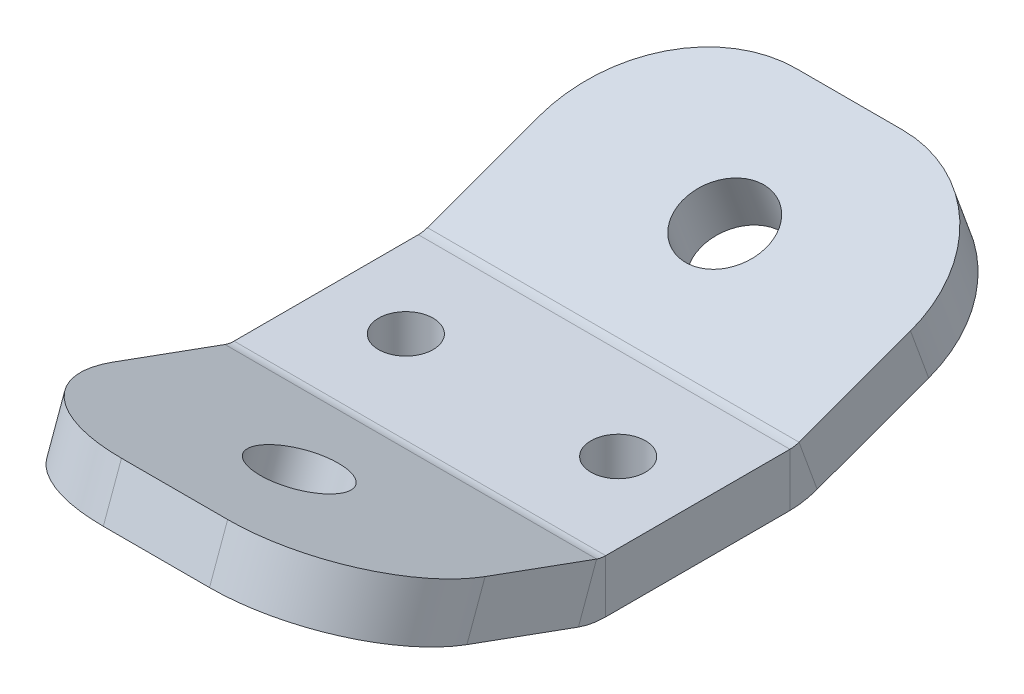
ISO-10303-21;
HEADER;
FILE_DESCRIPTION(('STEP AP214'),'2;1');
FILE_NAME('part.step','',(''),(''),'','','');
FILE_SCHEMA(('AUTOMOTIVE_DESIGN { 1 0 10303 214 1 1 1 1 }'));
ENDSEC;
DATA;
#1=APPLICATION_CONTEXT('core data for automotive mechanical design processes');
#2=APPLICATION_PROTOCOL_DEFINITION('international standard','automotive_design',2000,#1);
#3=PRODUCT_CONTEXT('',#1,'mechanical');
#4=PRODUCT('Part','Part','',(#3));
#5=PRODUCT_RELATED_PRODUCT_CATEGORY('part','',(#4));
#6=PRODUCT_DEFINITION_FORMATION('','',#4);
#7=PRODUCT_DEFINITION_CONTEXT('part definition',#1,'design');
#8=PRODUCT_DEFINITION('design','',#6,#7);
#9=PRODUCT_DEFINITION_SHAPE('','',#8);
#10=(LENGTH_UNIT() NAMED_UNIT(*) SI_UNIT(.MILLI.,.METRE.));
#11=(NAMED_UNIT(*) PLANE_ANGLE_UNIT() SI_UNIT($,.RADIAN.));
#12=(NAMED_UNIT(*) SI_UNIT($,.STERADIAN.) SOLID_ANGLE_UNIT());
#13=UNCERTAINTY_MEASURE_WITH_UNIT(LENGTH_MEASURE(1.E-05),#10,'distance_accuracy_value','');
#14=(GEOMETRIC_REPRESENTATION_CONTEXT(3) GLOBAL_UNCERTAINTY_ASSIGNED_CONTEXT((#13)) GLOBAL_UNIT_ASSIGNED_CONTEXT((#10,
#11,#12)) REPRESENTATION_CONTEXT('',''));
#15=CARTESIAN_POINT('',(0.,0.,0.));
#16=DIRECTION('',(0.,0.,1.));
#17=DIRECTION('',(1.,0.,0.));
#18=AXIS2_PLACEMENT_3D('',#15,#16,#17);
#19=CARTESIAN_POINT('',(22.225,0.,-11.0204855087519));
#20=DIRECTION('',(1.,0.,0.));
#21=DIRECTION('',(0.,0.,-1.));
#22=AXIS2_PLACEMENT_3D('',#19,#20,#21);
#23=PLANE('',#22);
#24=DIRECTION('',(0.,1.,0.));
#25=VECTOR('',#24,1.);
#26=CARTESIAN_POINT('',(22.225,0.,-11.0204855087519));
#27=LINE('',#26,#25);
#28=CARTESIAN_POINT('',(22.225,0.,-11.0204855087519));
#29=VERTEX_POINT('',#28);
#30=CARTESIAN_POINT('',(22.225,6.35,-11.0204855087519));
#31=VERTEX_POINT('',#30);
#32=EDGE_CURVE('E278',#29,#31,#27,.T.);
#33=ORIENTED_EDGE('',*,*,#32,.F.);
#34=CARTESIAN_POINT('',(22.225,9.525,-11.0204855087519));
#35=DIRECTION('',(1.,0.,0.));
#36=DIRECTION('',(0.,0.,-1.));
#37=AXIS2_PLACEMENT_3D('',#34,#35,#36);
#38=CIRCLE('',#37,9.525);
#39=CARTESIAN_POINT('',(22.225,0.574427787014234,-14.2782273739289));
#40=VERTEX_POINT('',#39);
#41=EDGE_CURVE('E196',#40,#29,#38,.F.);
#42=ORIENTED_EDGE('',*,*,#41,.F.);
#43=DIRECTION('',(0.,-0.939692620785908,-0.34202014332567));
#44=VECTOR('',#43,1.);
#45=CARTESIAN_POINT('',(22.225,6.54147592900475,-12.1063994638109));
#46=LINE('',#45,#44);
#47=CARTESIAN_POINT('',(22.225,6.54147592900475,-12.1063994638109));
#48=VERTEX_POINT('',#47);
#49=EDGE_CURVE('E275',#48,#40,#46,.T.);
#50=ORIENTED_EDGE('',*,*,#49,.F.);
#51=CARTESIAN_POINT('',(22.225,9.525,-11.0204855087519));
#52=DIRECTION('',(1.,0.,0.));
#53=DIRECTION('',(0.,0.,-1.));
#54=AXIS2_PLACEMENT_3D('',#51,#52,#53);
#55=CIRCLE('',#54,3.175);
#56=EDGE_CURVE('E206',#48,#31,#55,.F.);
#57=ORIENTED_EDGE('',*,*,#56,.T.);
#58=EDGE_LOOP('',(#33,#42,#50,#57));
#59=FACE_BOUND('',#58,.T.);
#60=ADVANCED_FACE('F38',(#59),#23,.T.);
#61=CARTESIAN_POINT('',(22.225,6.54147592900475,-12.1063994638109));
#62=DIRECTION('',(1.,0.,0.));
#63=DIRECTION('',(0.,0.,-1.));
#64=AXIS2_PLACEMENT_3D('',#61,#62,#63);
#65=PLANE('',#64);
#66=DIRECTION('',(0.,0.,1.));
#67=VECTOR('',#66,1.);
#68=CARTESIAN_POINT('',(22.225,0.,12.7));
#69=LINE('',#68,#67);
#70=CARTESIAN_POINT('',(22.225,0.,11.0204855087519));
#71=VERTEX_POINT('',#70);
#72=EDGE_CURVE('E194',#29,#71,#69,.T.);
#73=ORIENTED_EDGE('',*,*,#72,.F.);
#74=ORIENTED_EDGE('',*,*,#32,.T.);
#75=DIRECTION('',(0.,0.,-1.));
#76=VECTOR('',#75,1.);
#77=CARTESIAN_POINT('',(22.225,6.35,12.7));
#78=LINE('',#77,#76);
#79=CARTESIAN_POINT('',(22.225,6.35,11.0204855087519));
#80=VERTEX_POINT('',#79);
#81=EDGE_CURVE('E209',#31,#80,#78,.F.);
#82=ORIENTED_EDGE('',*,*,#81,.T.);
#83=DIRECTION('',(0.,-1.,0.));
#84=VECTOR('',#83,1.);
#85=CARTESIAN_POINT('',(22.225,6.35,11.0204855087519));
#86=LINE('',#85,#84);
#87=EDGE_CURVE('E167',#80,#71,#86,.T.);
#88=ORIENTED_EDGE('',*,*,#87,.T.);
#89=EDGE_LOOP('',(#73,#74,#82,#88));
#90=FACE_BOUND('',#89,.T.);
#91=ADVANCED_FACE('F369',(#90),#65,.T.);
#92=CARTESIAN_POINT('',(-22.225,0.574427787014234,-14.2782273739289));
#93=DIRECTION('',(-1.,0.,0.));
#94=DIRECTION('',(0.,0.,1.));
#95=AXIS2_PLACEMENT_3D('',#92,#93,#94);
#96=PLANE('',#95);
#97=DIRECTION('',(0.,0.939692620785908,0.34202014332567));
#98=VECTOR('',#97,1.);
#99=CARTESIAN_POINT('',(-22.225,0.574427787014234,-14.2782273739289));
#100=LINE('',#99,#98);
#101=CARTESIAN_POINT('',(-22.225,0.574427787014234,-14.2782273739289));
#102=VERTEX_POINT('',#101);
#103=CARTESIAN_POINT('',(-22.225,6.54147592900475,-12.1063994638109));
#104=VERTEX_POINT('',#103);
#105=EDGE_CURVE('E272',#102,#104,#100,.T.);
#106=ORIENTED_EDGE('',*,*,#105,.F.);
#107=CARTESIAN_POINT('',(-22.225,9.525,-11.0204855087519));
#108=DIRECTION('',(1.,0.,0.));
#109=DIRECTION('',(0.,0.,-1.));
#110=AXIS2_PLACEMENT_3D('',#107,#108,#109);
#111=CIRCLE('',#110,9.525);
#112=CARTESIAN_POINT('',(-22.225,0.,-11.0204855087519));
#113=VERTEX_POINT('',#112);
#114=EDGE_CURVE('E224',#102,#113,#111,.F.);
#115=ORIENTED_EDGE('',*,*,#114,.T.);
#116=DIRECTION('',(0.,-1.,0.));
#117=VECTOR('',#116,1.);
#118=CARTESIAN_POINT('',(-22.225,6.35,-11.0204855087519));
#119=LINE('',#118,#117);
#120=CARTESIAN_POINT('',(-22.225,6.35,-11.0204855087519));
#121=VERTEX_POINT('',#120);
#122=EDGE_CURVE('E166',#121,#113,#119,.T.);
#123=ORIENTED_EDGE('',*,*,#122,.F.);
#124=CARTESIAN_POINT('',(-22.225,9.525,-11.0204855087519));
#125=DIRECTION('',(1.,0.,0.));
#126=DIRECTION('',(0.,0.,-1.));
#127=AXIS2_PLACEMENT_3D('',#124,#125,#126);
#128=CIRCLE('',#127,3.175);
#129=EDGE_CURVE('E231',#104,#121,#128,.F.);
#130=ORIENTED_EDGE('',*,*,#129,.F.);
#131=EDGE_LOOP('',(#106,#115,#123,#130));
#132=FACE_BOUND('',#131,.T.);
#133=ADVANCED_FACE('F375',(#132),#96,.T.);
#134=CARTESIAN_POINT('',(-22.225,6.35,-11.0204855087519));
#135=DIRECTION('',(-1.,0.,0.));
#136=DIRECTION('',(0.,0.,1.));
#137=AXIS2_PLACEMENT_3D('',#134,#135,#136);
#138=PLANE('',#137);
#139=DIRECTION('',(0.,-0.34202014332567,0.939692620785908));
#140=VECTOR('',#139,1.);
#141=CARTESIAN_POINT('',(-22.225,5.96704814199052,-10.528172089882));
#142=LINE('',#141,#140);
#143=CARTESIAN_POINT('',(-22.225,11.3966179172855,-25.4457924448583));
#144=VERTEX_POINT('',#143);
#145=EDGE_CURVE('E229',#144,#104,#142,.T.);
#146=ORIENTED_EDGE('',*,*,#145,.F.);
#147=DIRECTION('',(0.,-0.939692620785908,-0.342020143325669));
#148=VECTOR('',#147,1.);
#149=CARTESIAN_POINT('',(-22.225,11.5765464348294,-25.3803038201767));
#150=LINE('',#149,#148);
#151=CARTESIAN_POINT('',(-22.225,5.429569775295,-27.6176203549763));
#152=VERTEX_POINT('',#151);
#153=EDGE_CURVE('E297',#144,#152,#150,.T.);
#154=ORIENTED_EDGE('',*,*,#153,.T.);
#155=DIRECTION('',(0.,-0.342020143325669,0.939692620785908));
#156=VECTOR('',#155,1.);
#157=CARTESIAN_POINT('',(-22.225,0.,-12.7));
#158=LINE('',#157,#156);
#159=EDGE_CURVE('E227',#152,#102,#158,.T.);
#160=ORIENTED_EDGE('',*,*,#159,.T.);
#161=ORIENTED_EDGE('',*,*,#105,.T.);
#162=EDGE_LOOP('',(#146,#154,#160,#161));
#163=FACE_BOUND('',#162,.T.);
#164=ADVANCED_FACE('F398',(#163),#138,.T.);
#165=CARTESIAN_POINT('',(22.225,0.574427787014224,14.2782273739289));
#166=DIRECTION('',(1.,0.,0.));
#167=DIRECTION('',(0.,0.,-1.));
#168=AXIS2_PLACEMENT_3D('',#165,#166,#167);
#169=PLANE('',#168);
#170=DIRECTION('',(0.,0.939692620785908,-0.342020143325669));
#171=VECTOR('',#170,1.);
#172=CARTESIAN_POINT('',(22.225,0.574427787014224,14.2782273739289));
#173=LINE('',#172,#171);
#174=CARTESIAN_POINT('',(22.225,0.574427787014224,14.2782273739289));
#175=VERTEX_POINT('',#174);
#176=CARTESIAN_POINT('',(22.225,6.54147592900474,12.1063994638109));
#177=VERTEX_POINT('',#176);
#178=EDGE_CURVE('E154',#175,#177,#173,.T.);
#179=ORIENTED_EDGE('',*,*,#178,.F.);
#180=CARTESIAN_POINT('',(22.225,9.525,11.0204855087519));
#181=DIRECTION('',(1.,0.,0.));
#182=DIRECTION('',(0.,0.,-1.));
#183=AXIS2_PLACEMENT_3D('',#180,#181,#182);
#184=CIRCLE('',#183,9.525);
#185=EDGE_CURVE('E158',#71,#175,#184,.F.);
#186=ORIENTED_EDGE('',*,*,#185,.F.);
#187=ORIENTED_EDGE('',*,*,#87,.F.);
#188=CARTESIAN_POINT('',(22.225,9.525,11.0204855087519));
#189=DIRECTION('',(1.,0.,0.));
#190=DIRECTION('',(0.,0.,-1.));
#191=AXIS2_PLACEMENT_3D('',#188,#189,#190);
#192=CIRCLE('',#191,3.175);
#193=EDGE_CURVE('E161',#80,#177,#192,.F.);
#194=ORIENTED_EDGE('',*,*,#193,.T.);
#195=EDGE_LOOP('',(#179,#186,#187,#194));
#196=FACE_BOUND('',#195,.T.);
#197=ADVANCED_FACE('F156',(#196),#169,.T.);
#198=CARTESIAN_POINT('',(22.225,6.35,11.0204855087519));
#199=DIRECTION('',(1.,0.,0.));
#200=DIRECTION('',(0.,0.,-1.));
#201=AXIS2_PLACEMENT_3D('',#198,#199,#200);
#202=PLANE('',#201);
#203=DIRECTION('',(0.,0.34202014332567,0.939692620785908));
#204=VECTOR('',#203,1.);
#205=CARTESIAN_POINT('',(22.225,5.96704814199052,10.528172089882));
#206=LINE('',#205,#204);
#207=CARTESIAN_POINT('',(22.225,11.3966179172855,25.4457924448583));
#208=VERTEX_POINT('',#207);
#209=EDGE_CURVE('E189',#177,#208,#206,.T.);
#210=ORIENTED_EDGE('',*,*,#209,.T.);
#211=DIRECTION('',(0.,0.939692620785908,-0.342020143325669));
#212=VECTOR('',#211,1.);
#213=CARTESIAN_POINT('',(22.225,11.5765464348294,25.3803038201767));
#214=LINE('',#213,#212);
#215=CARTESIAN_POINT('',(22.225,5.429569775295,27.6176203549763));
#216=VERTEX_POINT('',#215);
#217=EDGE_CURVE('E188',#208,#216,#214,.F.);
#218=ORIENTED_EDGE('',*,*,#217,.T.);
#219=DIRECTION('',(0.,0.342020143325669,0.939692620785908));
#220=VECTOR('',#219,1.);
#221=CARTESIAN_POINT('',(22.225,0.,12.7));
#222=LINE('',#221,#220);
#223=EDGE_CURVE('E176',#175,#216,#222,.T.);
#224=ORIENTED_EDGE('',*,*,#223,.F.);
#225=ORIENTED_EDGE('',*,*,#178,.T.);
#226=EDGE_LOOP('',(#210,#218,#224,#225));
#227=FACE_BOUND('',#226,.T.);
#228=ADVANCED_FACE('F186',(#227),#202,.T.);
#229=CARTESIAN_POINT('',(-22.225,0.,11.0204855087519));
#230=DIRECTION('',(-1.,0.,0.));
#231=DIRECTION('',(0.,0.,1.));
#232=AXIS2_PLACEMENT_3D('',#229,#230,#231);
#233=PLANE('',#232);
#234=DIRECTION('',(0.,1.,0.));
#235=VECTOR('',#234,1.);
#236=CARTESIAN_POINT('',(-22.225,0.,11.0204855087519));
#237=LINE('',#236,#235);
#238=CARTESIAN_POINT('',(-22.225,0.,11.0204855087519));
#239=VERTEX_POINT('',#238);
#240=CARTESIAN_POINT('',(-22.225,6.35,11.0204855087519));
#241=VERTEX_POINT('',#240);
#242=EDGE_CURVE('E268',#239,#241,#237,.T.);
#243=ORIENTED_EDGE('',*,*,#242,.F.);
#244=CARTESIAN_POINT('',(-22.225,9.525,11.0204855087519));
#245=DIRECTION('',(1.,0.,0.));
#246=DIRECTION('',(0.,0.,-1.));
#247=AXIS2_PLACEMENT_3D('',#244,#245,#246);
#248=CIRCLE('',#247,9.525);
#249=CARTESIAN_POINT('',(-22.225,0.574427787014224,14.2782273739289));
#250=VERTEX_POINT('',#249);
#251=EDGE_CURVE('E219',#239,#250,#248,.F.);
#252=ORIENTED_EDGE('',*,*,#251,.T.);
#253=DIRECTION('',(0.,-0.939692620785908,0.342020143325669));
#254=VECTOR('',#253,1.);
#255=CARTESIAN_POINT('',(-22.225,6.54147592900474,12.1063994638109));
#256=LINE('',#255,#254);
#257=CARTESIAN_POINT('',(-22.225,6.54147592900474,12.1063994638109));
#258=VERTEX_POINT('',#257);
#259=EDGE_CURVE('E266',#258,#250,#256,.T.);
#260=ORIENTED_EDGE('',*,*,#259,.F.);
#261=CARTESIAN_POINT('',(-22.225,9.525,11.0204855087519));
#262=DIRECTION('',(1.,0.,0.));
#263=DIRECTION('',(0.,0.,-1.));
#264=AXIS2_PLACEMENT_3D('',#261,#262,#263);
#265=CIRCLE('',#264,3.175);
#266=EDGE_CURVE('E237',#241,#258,#265,.F.);
#267=ORIENTED_EDGE('',*,*,#266,.F.);
#268=EDGE_LOOP('',(#243,#252,#260,#267));
#269=FACE_BOUND('',#268,.T.);
#270=ADVANCED_FACE('F352',(#269),#233,.T.);
#271=CARTESIAN_POINT('',(-22.225,6.54147592900474,12.1063994638109));
#272=DIRECTION('',(-1.,0.,0.));
#273=DIRECTION('',(0.,0.,1.));
#274=AXIS2_PLACEMENT_3D('',#271,#272,#273);
#275=PLANE('',#274);
#276=DIRECTION('',(0.,0.,1.));
#277=VECTOR('',#276,1.);
#278=CARTESIAN_POINT('',(-22.225,0.,12.7));
#279=LINE('',#278,#277);
#280=EDGE_CURVE('E221',#113,#239,#279,.T.);
#281=ORIENTED_EDGE('',*,*,#280,.T.);
#282=ORIENTED_EDGE('',*,*,#242,.T.);
#283=DIRECTION('',(0.,0.,-1.));
#284=VECTOR('',#283,1.);
#285=CARTESIAN_POINT('',(-22.225,6.35,12.7));
#286=LINE('',#285,#284);
#287=EDGE_CURVE('E234',#121,#241,#286,.F.);
#288=ORIENTED_EDGE('',*,*,#287,.F.);
#289=ORIENTED_EDGE('',*,*,#122,.T.);
#290=EDGE_LOOP('',(#281,#282,#288,#289));
#291=FACE_BOUND('',#290,.T.);
#292=ADVANCED_FACE('F358',(#291),#275,.T.);
#293=CARTESIAN_POINT('',(22.225,5.96704814199052,10.528172089882));
#294=DIRECTION('',(0.,-0.939692620785908,0.34202014332567));
#295=DIRECTION('',(0.,-0.34202014332567,-0.939692620785908));
#296=AXIS2_PLACEMENT_3D('',#293,#294,#295);
#297=PLANE('',#296);
#298=CARTESIAN_POINT('',(0.,11.3966179172855,25.4457924448583));
#299=DIRECTION('',(0.,-0.939692620785908,0.34202014332567));
#300=DIRECTION('',(0.,-0.34202014332567,-0.939692620785908));
#301=AXIS2_PLACEMENT_3D('',#298,#299,#300);
#302=CIRCLE('',#301,4.9657);
#303=CARTESIAN_POINT('',(0.,9.69824849157324,20.7795607978217));
#304=VERTEX_POINT('',#303);
#305=EDGE_CURVE('E320',#304,#304,#302,.T.);
#306=ORIENTED_EDGE('',*,*,#305,.T.);
#307=EDGE_LOOP('',(#306));
#308=FACE_BOUND('',#307,.T.);
#309=DIRECTION('',(0.,0.34202014332567,0.939692620785908));
#310=VECTOR('',#309,1.);
#311=CARTESIAN_POINT('',(-22.225,5.96704814199052,10.528172089882));
#312=LINE('',#311,#310);
#313=CARTESIAN_POINT('',(-22.225,11.3966179172855,25.4457924448583));
#314=VERTEX_POINT('',#313);
#315=EDGE_CURVE('E214',#258,#314,#312,.T.);
#316=ORIENTED_EDGE('',*,*,#315,.T.);
#317=CARTESIAN_POINT('',(-6.35,11.3966179172855,25.4457924448583));
#318=DIRECTION('',(0.,-0.939692620785908,0.34202014332567));
#319=DIRECTION('',(0.,-0.34202014332567,-0.939692620785908));
#320=AXIS2_PLACEMENT_3D('',#317,#318,#319);
#321=CIRCLE('',#320,15.875);
#322=CARTESIAN_POINT('',(-6.35,16.8261876925805,40.3634127998346));
#323=VERTEX_POINT('',#322);
#324=EDGE_CURVE('E285',#314,#323,#321,.F.);
#325=ORIENTED_EDGE('',*,*,#324,.T.);
#326=DIRECTION('',(-1.,0.,0.));
#327=VECTOR('',#326,1.);
#328=CARTESIAN_POINT('',(22.225,16.8261876925805,40.3634127998346));
#329=LINE('',#328,#327);
#330=CARTESIAN_POINT('',(6.35,16.8261876925805,40.3634127998346));
#331=VERTEX_POINT('',#330);
#332=EDGE_CURVE('E263',#331,#323,#329,.T.);
#333=ORIENTED_EDGE('',*,*,#332,.F.);
#334=CARTESIAN_POINT('',(6.35,11.3966179172855,25.4457924448583));
#335=DIRECTION('',(0.,-0.939692620785908,0.34202014332567));
#336=DIRECTION('',(0.,-0.34202014332567,-0.939692620785908));
#337=AXIS2_PLACEMENT_3D('',#334,#335,#336);
#338=CIRCLE('',#337,15.875);
#339=EDGE_CURVE('E283',#331,#208,#338,.F.);
#340=ORIENTED_EDGE('',*,*,#339,.T.);
#341=ORIENTED_EDGE('',*,*,#209,.F.);
#342=DIRECTION('',(-1.,0.,0.));
#343=VECTOR('',#342,1.);
#344=CARTESIAN_POINT('',(22.225,6.54147592900474,12.1063994638109));
#345=LINE('',#344,#343);
#346=EDGE_CURVE('E213',#177,#258,#345,.T.);
#347=ORIENTED_EDGE('',*,*,#346,.T.);
#348=EDGE_LOOP('',(#316,#325,#333,#340,#341,#347));
#349=FACE_BOUND('',#348,.T.);
#350=ADVANCED_FACE('F356',(#308,#349),#297,.F.);
#351=CARTESIAN_POINT('',(22.225,10.85913955059,42.5352407099526));
#352=DIRECTION('',(0.,0.342020143325669,0.939692620785908));
#353=DIRECTION('',(0.,-0.939692620785908,0.342020143325669));
#354=AXIS2_PLACEMENT_3D('',#351,#352,#353);
#355=PLANE('',#354);
#356=ORIENTED_EDGE('',*,*,#332,.T.);
#357=DIRECTION('',(0.,0.939692620785908,-0.342020143325669));
#358=VECTOR('',#357,1.);
#359=CARTESIAN_POINT('',(-6.35,10.85913955059,42.5352407099526));
#360=LINE('',#359,#358);
#361=CARTESIAN_POINT('',(-6.35,10.85913955059,42.5352407099526));
#362=VERTEX_POINT('',#361);
#363=EDGE_CURVE('E290',#323,#362,#360,.F.);
#364=ORIENTED_EDGE('',*,*,#363,.T.);
#365=DIRECTION('',(-1.,0.,0.));
#366=VECTOR('',#365,1.);
#367=CARTESIAN_POINT('',(22.225,10.85913955059,42.5352407099526));
#368=LINE('',#367,#366);
#369=CARTESIAN_POINT('',(6.35,10.85913955059,42.5352407099526));
#370=VERTEX_POINT('',#369);
#371=EDGE_CURVE('E183',#370,#362,#368,.T.);
#372=ORIENTED_EDGE('',*,*,#371,.F.);
#373=DIRECTION('',(0.,0.939692620785908,-0.342020143325669));
#374=VECTOR('',#373,1.);
#375=CARTESIAN_POINT('',(6.35,10.85913955059,42.5352407099526));
#376=LINE('',#375,#374);
#377=EDGE_CURVE('E287',#370,#331,#376,.T.);
#378=ORIENTED_EDGE('',*,*,#377,.T.);
#379=EDGE_LOOP('',(#356,#364,#372,#378));
#380=FACE_BOUND('',#379,.T.);
#381=ADVANCED_FACE('F341',(#380),#355,.T.);
#382=CARTESIAN_POINT('',(22.225,0.,12.7));
#383=DIRECTION('',(0.,-0.939692620785908,0.342020143325669));
#384=DIRECTION('',(0.,-0.342020143325669,-0.939692620785908));
#385=AXIS2_PLACEMENT_3D('',#382,#383,#384);
#386=PLANE('',#385);
#387=CARTESIAN_POINT('',(0.,5.429569775295,27.6176203549763));
#388=DIRECTION('',(0.,-0.939692620785908,0.342020143325669));
#389=DIRECTION('',(0.,-0.342020143325669,-0.939692620785908));
#390=AXIS2_PLACEMENT_3D('',#387,#388,#389);
#391=CIRCLE('',#390,4.9657);
#392=CARTESIAN_POINT('',(0.,3.73120034958272,22.9513887079397));
#393=VERTEX_POINT('',#392);
#394=EDGE_CURVE('E315',#393,#393,#391,.T.);
#395=ORIENTED_EDGE('',*,*,#394,.F.);
#396=EDGE_LOOP('',(#395));
#397=FACE_BOUND('',#396,.T.);
#398=ORIENTED_EDGE('',*,*,#371,.T.);
#399=CARTESIAN_POINT('',(-6.35,5.42956977529501,27.6176203549763));
#400=DIRECTION('',(0.,-0.939692620785908,0.342020143325669));
#401=DIRECTION('',(0.,-0.342020143325669,-0.939692620785908));
#402=AXIS2_PLACEMENT_3D('',#399,#400,#401);
#403=CIRCLE('',#402,15.875);
#404=CARTESIAN_POINT('',(-22.225,5.429569775295,27.6176203549763));
#405=VERTEX_POINT('',#404);
#406=EDGE_CURVE('E294',#362,#405,#403,.T.);
#407=ORIENTED_EDGE('',*,*,#406,.T.);
#408=DIRECTION('',(0.,0.342020143325669,0.939692620785908));
#409=VECTOR('',#408,1.);
#410=CARTESIAN_POINT('',(-22.225,0.,12.7));
#411=LINE('',#410,#409);
#412=EDGE_CURVE('E179',#250,#405,#411,.T.);
#413=ORIENTED_EDGE('',*,*,#412,.F.);
#414=DIRECTION('',(-1.,0.,0.));
#415=VECTOR('',#414,1.);
#416=CARTESIAN_POINT('',(22.225,0.574427787014224,14.2782273739289));
#417=LINE('',#416,#415);
#418=EDGE_CURVE('E173',#175,#250,#417,.T.);
#419=ORIENTED_EDGE('',*,*,#418,.F.);
#420=ORIENTED_EDGE('',*,*,#223,.T.);
#421=CARTESIAN_POINT('',(6.35,5.429569775295,27.6176203549763));
#422=DIRECTION('',(0.,-0.939692620785908,0.342020143325669));
#423=DIRECTION('',(0.,-0.342020143325669,-0.939692620785908));
#424=AXIS2_PLACEMENT_3D('',#421,#422,#423);
#425=CIRCLE('',#424,15.875);
#426=EDGE_CURVE('E292',#216,#370,#425,.T.);
#427=ORIENTED_EDGE('',*,*,#426,.T.);
#428=EDGE_LOOP('',(#398,#407,#413,#419,#420,#427));
#429=FACE_BOUND('',#428,.T.);
#430=ADVANCED_FACE('F175',(#397,#429),#386,.T.);
#431=CARTESIAN_POINT('',(22.225,9.525,11.0204855087519));
#432=DIRECTION('',(-1.,0.,0.));
#433=DIRECTION('',(0.,0.,1.));
#434=AXIS2_PLACEMENT_3D('',#431,#432,#433);
#435=CYLINDRICAL_SURFACE('',#434,9.525);
#436=ORIENTED_EDGE('',*,*,#251,.F.);
#437=DIRECTION('',(-1.,0.,0.));
#438=VECTOR('',#437,1.);
#439=CARTESIAN_POINT('',(22.225,0.,11.0204855087519));
#440=LINE('',#439,#438);
#441=EDGE_CURVE('E184',#71,#239,#440,.T.);
#442=ORIENTED_EDGE('',*,*,#441,.F.);
#443=ORIENTED_EDGE('',*,*,#185,.T.);
#444=ORIENTED_EDGE('',*,*,#418,.T.);
#445=EDGE_LOOP('',(#436,#442,#443,#444));
#446=FACE_BOUND('',#445,.T.);
#447=ADVANCED_FACE('F192',(#446),#435,.T.);
#448=CARTESIAN_POINT('',(22.225,0.,12.7));
#449=DIRECTION('',(0.,-1.,0.));
#450=DIRECTION('',(0.,0.,-1.));
#451=AXIS2_PLACEMENT_3D('',#448,#449,#450);
#452=PLANE('',#451);
#453=CARTESIAN_POINT('',(12.7,0.,0.));
#454=DIRECTION('',(0.,-1.,0.));
#455=DIRECTION('',(0.,0.,-1.));
#456=AXIS2_PLACEMENT_3D('',#453,#454,#455);
#457=CIRCLE('',#456,3.2639);
#458=CARTESIAN_POINT('',(12.7,0.,-3.2639));
#459=VERTEX_POINT('',#458);
#460=EDGE_CURVE('E327',#459,#459,#457,.T.);
#461=ORIENTED_EDGE('',*,*,#460,.F.);
#462=EDGE_LOOP('',(#461));
#463=FACE_BOUND('',#462,.T.);
#464=CARTESIAN_POINT('',(-12.7,0.,0.));
#465=DIRECTION('',(0.,-1.,0.));
#466=DIRECTION('',(0.,0.,-1.));
#467=AXIS2_PLACEMENT_3D('',#464,#465,#466);
#468=CIRCLE('',#467,3.2639);
#469=CARTESIAN_POINT('',(-12.7,0.,-3.2639));
#470=VERTEX_POINT('',#469);
#471=EDGE_CURVE('E316',#470,#470,#468,.T.);
#472=ORIENTED_EDGE('',*,*,#471,.F.);
#473=EDGE_LOOP('',(#472));
#474=FACE_BOUND('',#473,.T.);
#475=ORIENTED_EDGE('',*,*,#280,.F.);
#476=DIRECTION('',(-1.,0.,0.));
#477=VECTOR('',#476,1.);
#478=CARTESIAN_POINT('',(22.225,0.,-11.0204855087519));
#479=LINE('',#478,#477);
#480=EDGE_CURVE('E258',#29,#113,#479,.T.);
#481=ORIENTED_EDGE('',*,*,#480,.F.);
#482=ORIENTED_EDGE('',*,*,#72,.T.);
#483=ORIENTED_EDGE('',*,*,#441,.T.);
#484=EDGE_LOOP('',(#475,#481,#482,#483));
#485=FACE_BOUND('',#484,.T.);
#486=ADVANCED_FACE('F417',(#463,#474,#485),#452,.T.);
#487=CARTESIAN_POINT('',(22.225,9.525,-11.0204855087519));
#488=DIRECTION('',(-1.,0.,0.));
#489=DIRECTION('',(0.,0.,1.));
#490=AXIS2_PLACEMENT_3D('',#487,#488,#489);
#491=CYLINDRICAL_SURFACE('',#490,9.525);
#492=ORIENTED_EDGE('',*,*,#114,.F.);
#493=DIRECTION('',(-1.,0.,0.));
#494=VECTOR('',#493,1.);
#495=CARTESIAN_POINT('',(22.225,0.574427787014234,-14.2782273739289));
#496=LINE('',#495,#494);
#497=EDGE_CURVE('E255',#40,#102,#496,.T.);
#498=ORIENTED_EDGE('',*,*,#497,.F.);
#499=ORIENTED_EDGE('',*,*,#41,.T.);
#500=ORIENTED_EDGE('',*,*,#480,.T.);
#501=EDGE_LOOP('',(#492,#498,#499,#500));
#502=FACE_BOUND('',#501,.T.);
#503=ADVANCED_FACE('F412',(#502),#491,.T.);
#504=CARTESIAN_POINT('',(22.225,0.,-12.7));
#505=DIRECTION('',(0.,-0.939692620785908,-0.342020143325669));
#506=DIRECTION('',(0.,0.342020143325669,-0.939692620785908));
#507=AXIS2_PLACEMENT_3D('',#504,#505,#506);
#508=PLANE('',#507);
#509=CARTESIAN_POINT('',(0.,5.429569775295,-27.6176203549763));
#510=DIRECTION('',(0.,-0.939692620785908,-0.342020143325669));
#511=DIRECTION('',(0.,0.342020143325669,-0.939692620785908));
#512=AXIS2_PLACEMENT_3D('',#509,#510,#511);
#513=CIRCLE('',#512,4.9657);
#514=CARTESIAN_POINT('',(0.,7.12793920100728,-32.2838520020129));
#515=VERTEX_POINT('',#514);
#516=EDGE_CURVE('E312',#515,#515,#513,.T.);
#517=ORIENTED_EDGE('',*,*,#516,.F.);
#518=EDGE_LOOP('',(#517));
#519=FACE_BOUND('',#518,.T.);
#520=ORIENTED_EDGE('',*,*,#159,.F.);
#521=CARTESIAN_POINT('',(-6.35,5.429569775295,-27.6176203549763));
#522=DIRECTION('',(0.,-0.939692620785908,-0.342020143325669));
#523=DIRECTION('',(0.,0.342020143325669,-0.939692620785908));
#524=AXIS2_PLACEMENT_3D('',#521,#522,#523);
#525=CIRCLE('',#524,15.875);
#526=CARTESIAN_POINT('',(-6.35,10.85913955059,-42.5352407099526));
#527=VERTEX_POINT('',#526);
#528=EDGE_CURVE('E302',#152,#527,#525,.T.);
#529=ORIENTED_EDGE('',*,*,#528,.T.);
#530=DIRECTION('',(-1.,0.,0.));
#531=VECTOR('',#530,1.);
#532=CARTESIAN_POINT('',(22.225,10.85913955059,-42.5352407099526));
#533=LINE('',#532,#531);
#534=CARTESIAN_POINT('',(6.35,10.85913955059,-42.5352407099526));
#535=VERTEX_POINT('',#534);
#536=EDGE_CURVE('E253',#535,#527,#533,.T.);
#537=ORIENTED_EDGE('',*,*,#536,.F.);
#538=CARTESIAN_POINT('',(6.35,5.429569775295,-27.6176203549763));
#539=DIRECTION('',(0.,-0.939692620785908,-0.342020143325669));
#540=DIRECTION('',(0.,0.342020143325669,-0.939692620785908));
#541=AXIS2_PLACEMENT_3D('',#538,#539,#540);
#542=CIRCLE('',#541,15.875);
#543=CARTESIAN_POINT('',(22.225,5.429569775295,-27.6176203549763));
#544=VERTEX_POINT('',#543);
#545=EDGE_CURVE('E300',#535,#544,#542,.T.);
#546=ORIENTED_EDGE('',*,*,#545,.T.);
#547=DIRECTION('',(0.,-0.342020143325669,0.939692620785908));
#548=VECTOR('',#547,1.);
#549=CARTESIAN_POINT('',(22.225,0.,-12.7));
#550=LINE('',#549,#548);
#551=EDGE_CURVE('E202',#544,#40,#550,.T.);
#552=ORIENTED_EDGE('',*,*,#551,.T.);
#553=ORIENTED_EDGE('',*,*,#497,.T.);
#554=EDGE_LOOP('',(#520,#529,#537,#546,#552,#553));
#555=FACE_BOUND('',#554,.T.);
#556=ADVANCED_FACE('F439',(#519,#555),#508,.T.);
#557=CARTESIAN_POINT('',(22.225,16.8261876925805,-40.3634127998346));
#558=DIRECTION('',(0.,0.342020143325669,-0.939692620785908));
#559=DIRECTION('',(0.,0.939692620785908,0.342020143325669));
#560=AXIS2_PLACEMENT_3D('',#557,#558,#559);
#561=PLANE('',#560);
#562=ORIENTED_EDGE('',*,*,#536,.T.);
#563=DIRECTION('',(0.,-0.939692620785908,-0.342020143325669));
#564=VECTOR('',#563,1.);
#565=CARTESIAN_POINT('',(-6.35,16.8261876925805,-40.3634127998346));
#566=LINE('',#565,#564);
#567=CARTESIAN_POINT('',(-6.35,16.8261876925805,-40.3634127998346));
#568=VERTEX_POINT('',#567);
#569=EDGE_CURVE('E61',#527,#568,#566,.F.);
#570=ORIENTED_EDGE('',*,*,#569,.T.);
#571=DIRECTION('',(-1.,0.,0.));
#572=VECTOR('',#571,1.);
#573=CARTESIAN_POINT('',(22.225,16.8261876925805,-40.3634127998346));
#574=LINE('',#573,#572);
#575=CARTESIAN_POINT('',(6.35,16.8261876925805,-40.3634127998346));
#576=VERTEX_POINT('',#575);
#577=EDGE_CURVE('E251',#576,#568,#574,.T.);
#578=ORIENTED_EDGE('',*,*,#577,.F.);
#579=DIRECTION('',(0.,-0.939692620785908,-0.342020143325669));
#580=VECTOR('',#579,1.);
#581=CARTESIAN_POINT('',(6.35,16.8261876925805,-40.3634127998346));
#582=LINE('',#581,#580);
#583=EDGE_CURVE('E304',#576,#535,#582,.T.);
#584=ORIENTED_EDGE('',*,*,#583,.T.);
#585=EDGE_LOOP('',(#562,#570,#578,#584));
#586=FACE_BOUND('',#585,.T.);
#587=ADVANCED_FACE('F435',(#586),#561,.T.);
#588=CARTESIAN_POINT('',(22.225,5.96704814199052,-10.528172089882));
#589=DIRECTION('',(0.,-0.939692620785908,-0.34202014332567));
#590=DIRECTION('',(0.,0.34202014332567,-0.939692620785908));
#591=AXIS2_PLACEMENT_3D('',#588,#589,#590);
#592=PLANE('',#591);
#593=CARTESIAN_POINT('',(0.,11.3966179172855,-25.4457924448583));
#594=DIRECTION('',(0.,-0.939692620785908,-0.34202014332567));
#595=DIRECTION('',(0.,0.34202014332567,-0.939692620785908));
#596=AXIS2_PLACEMENT_3D('',#593,#594,#595);
#597=CIRCLE('',#596,4.9657);
#598=CARTESIAN_POINT('',(0.,13.0949873429978,-30.1120240918949));
#599=VERTEX_POINT('',#598);
#600=EDGE_CURVE('E217',#599,#599,#597,.T.);
#601=ORIENTED_EDGE('',*,*,#600,.T.);
#602=EDGE_LOOP('',(#601));
#603=FACE_BOUND('',#602,.T.);
#604=ORIENTED_EDGE('',*,*,#577,.T.);
#605=CARTESIAN_POINT('',(-6.35,11.3966179172855,-25.4457924448583));
#606=DIRECTION('',(0.,-0.939692620785908,-0.34202014332567));
#607=DIRECTION('',(0.,0.34202014332567,-0.939692620785908));
#608=AXIS2_PLACEMENT_3D('',#605,#606,#607);
#609=CIRCLE('',#608,15.875);
#610=EDGE_CURVE('E47',#568,#144,#609,.F.);
#611=ORIENTED_EDGE('',*,*,#610,.T.);
#612=ORIENTED_EDGE('',*,*,#145,.T.);
#613=DIRECTION('',(-1.,0.,0.));
#614=VECTOR('',#613,1.);
#615=CARTESIAN_POINT('',(22.225,6.54147592900475,-12.1063994638109));
#616=LINE('',#615,#614);
#617=EDGE_CURVE('E248',#48,#104,#616,.T.);
#618=ORIENTED_EDGE('',*,*,#617,.F.);
#619=DIRECTION('',(0.,-0.34202014332567,0.939692620785908));
#620=VECTOR('',#619,1.);
#621=CARTESIAN_POINT('',(22.225,5.96704814199052,-10.528172089882));
#622=LINE('',#621,#620);
#623=CARTESIAN_POINT('',(22.225,11.3966179172855,-25.4457924448583));
#624=VERTEX_POINT('',#623);
#625=EDGE_CURVE('E204',#624,#48,#622,.T.);
#626=ORIENTED_EDGE('',*,*,#625,.F.);
#627=CARTESIAN_POINT('',(6.35,11.3966179172855,-25.4457924448583));
#628=DIRECTION('',(0.,-0.939692620785908,-0.34202014332567));
#629=DIRECTION('',(0.,0.34202014332567,-0.939692620785908));
#630=AXIS2_PLACEMENT_3D('',#627,#628,#629);
#631=CIRCLE('',#630,15.875);
#632=EDGE_CURVE('E308',#624,#576,#631,.F.);
#633=ORIENTED_EDGE('',*,*,#632,.T.);
#634=EDGE_LOOP('',(#604,#611,#612,#618,#626,#633));
#635=FACE_BOUND('',#634,.T.);
#636=ADVANCED_FACE('F395',(#603,#635),#592,.F.);
#637=CARTESIAN_POINT('',(22.225,9.525,-11.0204855087519));
#638=DIRECTION('',(-1.,0.,0.));
#639=DIRECTION('',(0.,0.,1.));
#640=AXIS2_PLACEMENT_3D('',#637,#638,#639);
#641=CYLINDRICAL_SURFACE('',#640,3.175);
#642=ORIENTED_EDGE('',*,*,#129,.T.);
#643=DIRECTION('',(-1.,0.,0.));
#644=VECTOR('',#643,1.);
#645=CARTESIAN_POINT('',(22.225,6.35,-11.0204855087519));
#646=LINE('',#645,#644);
#647=EDGE_CURVE('E245',#31,#121,#646,.T.);
#648=ORIENTED_EDGE('',*,*,#647,.F.);
#649=ORIENTED_EDGE('',*,*,#56,.F.);
#650=ORIENTED_EDGE('',*,*,#617,.T.);
#651=EDGE_LOOP('',(#642,#648,#649,#650));
#652=FACE_BOUND('',#651,.T.);
#653=ADVANCED_FACE('F405',(#652),#641,.F.);
#654=CARTESIAN_POINT('',(22.225,6.35,12.7));
#655=DIRECTION('',(0.,-1.,0.));
#656=DIRECTION('',(0.,0.,-1.));
#657=AXIS2_PLACEMENT_3D('',#654,#655,#656);
#658=PLANE('',#657);
#659=CARTESIAN_POINT('',(12.7,6.35,0.));
#660=DIRECTION('',(0.,-1.,0.));
#661=DIRECTION('',(0.,0.,-1.));
#662=AXIS2_PLACEMENT_3D('',#659,#660,#661);
#663=CIRCLE('',#662,3.2639);
#664=CARTESIAN_POINT('',(12.7,6.35,-3.2639));
#665=VERTEX_POINT('',#664);
#666=EDGE_CURVE('E42',#665,#665,#663,.T.);
#667=ORIENTED_EDGE('',*,*,#666,.T.);
#668=EDGE_LOOP('',(#667));
#669=FACE_BOUND('',#668,.T.);
#670=CARTESIAN_POINT('',(-12.7,6.35,0.));
#671=DIRECTION('',(0.,-1.,0.));
#672=DIRECTION('',(0.,0.,-1.));
#673=AXIS2_PLACEMENT_3D('',#670,#671,#672);
#674=CIRCLE('',#673,3.2639);
#675=CARTESIAN_POINT('',(-12.7,6.35,-3.2639));
#676=VERTEX_POINT('',#675);
#677=EDGE_CURVE('E313',#676,#676,#674,.T.);
#678=ORIENTED_EDGE('',*,*,#677,.T.);
#679=EDGE_LOOP('',(#678));
#680=FACE_BOUND('',#679,.T.);
#681=ORIENTED_EDGE('',*,*,#287,.T.);
#682=DIRECTION('',(-1.,0.,0.));
#683=VECTOR('',#682,1.);
#684=CARTESIAN_POINT('',(22.225,6.35,11.0204855087519));
#685=LINE('',#684,#683);
#686=EDGE_CURVE('E242',#80,#241,#685,.T.);
#687=ORIENTED_EDGE('',*,*,#686,.F.);
#688=ORIENTED_EDGE('',*,*,#81,.F.);
#689=ORIENTED_EDGE('',*,*,#647,.T.);
#690=EDGE_LOOP('',(#681,#687,#688,#689));
#691=FACE_BOUND('',#690,.T.);
#692=ADVANCED_FACE('F420',(#669,#680,#691),#658,.F.);
#693=CARTESIAN_POINT('',(22.225,9.525,11.0204855087519));
#694=DIRECTION('',(-1.,0.,0.));
#695=DIRECTION('',(0.,0.,1.));
#696=AXIS2_PLACEMENT_3D('',#693,#694,#695);
#697=CYLINDRICAL_SURFACE('',#696,3.175);
#698=ORIENTED_EDGE('',*,*,#266,.T.);
#699=ORIENTED_EDGE('',*,*,#346,.F.);
#700=ORIENTED_EDGE('',*,*,#193,.F.);
#701=ORIENTED_EDGE('',*,*,#686,.T.);
#702=EDGE_LOOP('',(#698,#699,#700,#701));
#703=FACE_BOUND('',#702,.T.);
#704=ADVANCED_FACE('F354',(#703),#697,.F.);
#705=CARTESIAN_POINT('',(22.225,9.525,11.0204855087519));
#706=DIRECTION('',(1.,0.,0.));
#707=DIRECTION('',(0.,0.,-1.));
#708=AXIS2_PLACEMENT_3D('',#705,#706,#707);
#709=PLANE('',#708);
#710=ORIENTED_EDGE('',*,*,#551,.F.);
#711=DIRECTION('',(0.,-0.939692620785908,-0.342020143325669));
#712=VECTOR('',#711,1.);
#713=CARTESIAN_POINT('',(22.225,21.4639735260365,-21.7815746655));
#714=LINE('',#713,#712);
#715=EDGE_CURVE('E11',#544,#624,#714,.F.);
#716=ORIENTED_EDGE('',*,*,#715,.T.);
#717=ORIENTED_EDGE('',*,*,#625,.T.);
#718=ORIENTED_EDGE('',*,*,#49,.T.);
#719=EDGE_LOOP('',(#710,#716,#717,#718));
#720=FACE_BOUND('',#719,.T.);
#721=ADVANCED_FACE('F428',(#720),#709,.T.);
#722=CARTESIAN_POINT('',(-22.225,9.525,11.0204855087519));
#723=DIRECTION('',(1.,0.,0.));
#724=DIRECTION('',(0.,0.,-1.));
#725=AXIS2_PLACEMENT_3D('',#722,#723,#724);
#726=PLANE('',#725);
#727=ORIENTED_EDGE('',*,*,#412,.T.);
#728=DIRECTION('',(0.,0.939692620785908,-0.342020143325669));
#729=VECTOR('',#728,1.);
#730=CARTESIAN_POINT('',(-22.225,11.3966179172855,25.4457924448583));
#731=LINE('',#730,#729);
#732=EDGE_CURVE('E280',#405,#314,#731,.T.);
#733=ORIENTED_EDGE('',*,*,#732,.T.);
#734=ORIENTED_EDGE('',*,*,#315,.F.);
#735=ORIENTED_EDGE('',*,*,#259,.T.);
#736=EDGE_LOOP('',(#727,#733,#734,#735));
#737=FACE_BOUND('',#736,.T.);
#738=ADVANCED_FACE('F348',(#737),#726,.F.);
#739=CARTESIAN_POINT('',(-6.35,14.3801419882808,24.3598784897993));
#740=DIRECTION('',(0.,-0.939692620785908,0.342020143325669));
#741=DIRECTION('',(0.,-0.342020143325669,-0.939692620785908));
#742=AXIS2_PLACEMENT_3D('',#739,#740,#741);
#743=CYLINDRICAL_SURFACE('',#742,15.875);
#744=ORIENTED_EDGE('',*,*,#406,.F.);
#745=ORIENTED_EDGE('',*,*,#363,.F.);
#746=ORIENTED_EDGE('',*,*,#324,.F.);
#747=ORIENTED_EDGE('',*,*,#732,.F.);
#748=EDGE_LOOP('',(#744,#745,#746,#747));
#749=FACE_BOUND('',#748,.T.);
#750=ADVANCED_FACE('F345',(#749),#743,.T.);
#751=CARTESIAN_POINT('',(6.35,5.42956977529502,27.6176203549763));
#752=DIRECTION('',(0.,0.939692620785908,-0.342020143325669));
#753=DIRECTION('',(0.,0.342020143325669,0.939692620785908));
#754=AXIS2_PLACEMENT_3D('',#751,#752,#753);
#755=CYLINDRICAL_SURFACE('',#754,15.875);
#756=ORIENTED_EDGE('',*,*,#426,.F.);
#757=ORIENTED_EDGE('',*,*,#217,.F.);
#758=ORIENTED_EDGE('',*,*,#339,.F.);
#759=ORIENTED_EDGE('',*,*,#377,.F.);
#760=EDGE_LOOP('',(#756,#757,#758,#759));
#761=FACE_BOUND('',#760,.T.);
#762=ADVANCED_FACE('F336',(#761),#755,.T.);
#763=CARTESIAN_POINT('',(-6.35,11.5765464348294,-25.3803038201767));
#764=DIRECTION('',(0.,-0.939692620785908,-0.342020143325669));
#765=DIRECTION('',(0.,0.342020143325669,-0.939692620785908));
#766=AXIS2_PLACEMENT_3D('',#763,#764,#765);
#767=CYLINDRICAL_SURFACE('',#766,15.875);
#768=ORIENTED_EDGE('',*,*,#610,.F.);
#769=ORIENTED_EDGE('',*,*,#569,.F.);
#770=ORIENTED_EDGE('',*,*,#528,.F.);
#771=ORIENTED_EDGE('',*,*,#153,.F.);
#772=EDGE_LOOP('',(#768,#769,#770,#771));
#773=FACE_BOUND('',#772,.T.);
#774=ADVANCED_FACE('F383',(#773),#767,.T.);
#775=CARTESIAN_POINT('',(6.35,11.3966179172855,-25.4457924448583));
#776=DIRECTION('',(0.,-0.939692620785908,-0.342020143325669));
#777=DIRECTION('',(0.,0.342020143325669,-0.939692620785908));
#778=AXIS2_PLACEMENT_3D('',#775,#776,#777);
#779=CYLINDRICAL_SURFACE('',#778,15.875);
#780=ORIENTED_EDGE('',*,*,#632,.F.);
#781=ORIENTED_EDGE('',*,*,#715,.F.);
#782=ORIENTED_EDGE('',*,*,#545,.F.);
#783=ORIENTED_EDGE('',*,*,#583,.F.);
#784=EDGE_LOOP('',(#780,#781,#782,#783));
#785=FACE_BOUND('',#784,.T.);
#786=ADVANCED_FACE('F40',(#785),#779,.T.);
#787=CARTESIAN_POINT('',(0.,12.5900275456836,-25.0114268628347));
#788=DIRECTION('',(0.,-0.939692620785908,-0.342020143325669));
#789=DIRECTION('',(0.,0.342020143325669,-0.939692620785908));
#790=AXIS2_PLACEMENT_3D('',#787,#788,#789);
#791=CYLINDRICAL_SURFACE('',#790,4.9657);
#792=ORIENTED_EDGE('',*,*,#516,.T.);
#793=EDGE_LOOP('',(#792));
#794=FACE_BOUND('',#793,.T.);
#795=ORIENTED_EDGE('',*,*,#600,.F.);
#796=EDGE_LOOP('',(#795));
#797=FACE_BOUND('',#796,.T.);
#798=ADVANCED_FACE('F389',(#794,#797),#791,.F.);
#799=CARTESIAN_POINT('',(0.,12.5900275456836,25.0114268628347));
#800=DIRECTION('',(0.,-0.939692620785908,0.342020143325669));
#801=DIRECTION('',(0.,-0.342020143325669,-0.939692620785908));
#802=AXIS2_PLACEMENT_3D('',#799,#800,#801);
#803=CYLINDRICAL_SURFACE('',#802,4.9657);
#804=ORIENTED_EDGE('',*,*,#394,.T.);
#805=EDGE_LOOP('',(#804));
#806=FACE_BOUND('',#805,.T.);
#807=ORIENTED_EDGE('',*,*,#305,.F.);
#808=EDGE_LOOP('',(#807));
#809=FACE_BOUND('',#808,.T.);
#810=ADVANCED_FACE('F456',(#806,#809),#803,.F.);
#811=CARTESIAN_POINT('',(-12.7,7.62,0.));
#812=DIRECTION('',(0.,-1.,0.));
#813=DIRECTION('',(0.,0.,-1.));
#814=AXIS2_PLACEMENT_3D('',#811,#812,#813);
#815=CYLINDRICAL_SURFACE('',#814,3.2639);
#816=CARTESIAN_POINT('',(-12.7,0.,-3.2639));
#817=CARTESIAN_POINT('',(-12.7,0.0661458333333333,-3.2639));
#818=CARTESIAN_POINT('',(-12.7,0.132291666666667,-3.2639));
#819=CARTESIAN_POINT('',(-12.7,0.264583333333333,-3.2639));
#820=CARTESIAN_POINT('',(-12.7,0.330729166666666,-3.2639));
#821=CARTESIAN_POINT('',(-12.7,0.463020833333333,-3.2639));
#822=CARTESIAN_POINT('',(-12.7,0.529166666666667,-3.2639));
#823=CARTESIAN_POINT('',(-12.7,0.661458333333334,-3.2639));
#824=CARTESIAN_POINT('',(-12.7,0.727604166666667,-3.2639));
#825=CARTESIAN_POINT('',(-12.7,0.859895833333334,-3.2639));
#826=CARTESIAN_POINT('',(-12.7,0.926041666666667,-3.2639));
#827=CARTESIAN_POINT('',(-12.7,1.05833333333333,-3.2639));
#828=CARTESIAN_POINT('',(-12.7,1.12447916666667,-3.2639));
#829=CARTESIAN_POINT('',(-12.7,1.25677083333333,-3.2639));
#830=CARTESIAN_POINT('',(-12.7,1.32291666666667,-3.2639));
#831=CARTESIAN_POINT('',(-12.7,1.45520833333333,-3.2639));
#832=CARTESIAN_POINT('',(-12.7,1.52135416666667,-3.2639));
#833=CARTESIAN_POINT('',(-12.7,1.65364583333333,-3.2639));
#834=CARTESIAN_POINT('',(-12.7,1.71979166666667,-3.2639));
#835=CARTESIAN_POINT('',(-12.7,1.85208333333333,-3.2639));
#836=CARTESIAN_POINT('',(-12.7,1.91822916666667,-3.2639));
#837=CARTESIAN_POINT('',(-12.7,2.05052083333333,-3.2639));
#838=CARTESIAN_POINT('',(-12.7,2.11666666666667,-3.2639));
#839=CARTESIAN_POINT('',(-12.7,2.24895833333333,-3.2639));
#840=CARTESIAN_POINT('',(-12.7,2.31510416666667,-3.2639));
#841=CARTESIAN_POINT('',(-12.7,2.44739583333333,-3.2639));
#842=CARTESIAN_POINT('',(-12.7,2.51354166666667,-3.2639));
#843=CARTESIAN_POINT('',(-12.7,2.64583333333333,-3.2639));
#844=CARTESIAN_POINT('',(-12.7,2.71197916666667,-3.2639));
#845=CARTESIAN_POINT('',(-12.7,2.84427083333333,-3.2639));
#846=CARTESIAN_POINT('',(-12.7,2.91041666666667,-3.2639));
#847=CARTESIAN_POINT('',(-12.7,3.04270833333333,-3.2639));
#848=CARTESIAN_POINT('',(-12.7,3.10885416666667,-3.2639));
#849=CARTESIAN_POINT('',(-12.7,3.24114583333333,-3.2639));
#850=CARTESIAN_POINT('',(-12.7,3.30729166666667,-3.2639));
#851=CARTESIAN_POINT('',(-12.7,3.43958333333333,-3.2639));
#852=CARTESIAN_POINT('',(-12.7,3.50572916666667,-3.2639));
#853=CARTESIAN_POINT('',(-12.7,3.63802083333333,-3.2639));
#854=CARTESIAN_POINT('',(-12.7,3.70416666666667,-3.2639));
#855=CARTESIAN_POINT('',(-12.7,3.83645833333333,-3.2639));
#856=CARTESIAN_POINT('',(-12.7,3.90260416666667,-3.2639));
#857=CARTESIAN_POINT('',(-12.7,4.03489583333333,-3.2639));
#858=CARTESIAN_POINT('',(-12.7,4.10104166666667,-3.2639));
#859=CARTESIAN_POINT('',(-12.7,4.23333333333333,-3.2639));
#860=CARTESIAN_POINT('',(-12.7,4.29947916666667,-3.2639));
#861=CARTESIAN_POINT('',(-12.7,4.43177083333333,-3.2639));
#862=CARTESIAN_POINT('',(-12.7,4.49791666666667,-3.2639));
#863=CARTESIAN_POINT('',(-12.7,4.63020833333333,-3.2639));
#864=CARTESIAN_POINT('',(-12.7,4.69635416666667,-3.2639));
#865=CARTESIAN_POINT('',(-12.7,4.82864583333333,-3.2639));
#866=CARTESIAN_POINT('',(-12.7,4.89479166666667,-3.2639));
#867=CARTESIAN_POINT('',(-12.7,5.02708333333333,-3.2639));
#868=CARTESIAN_POINT('',(-12.7,5.09322916666667,-3.2639));
#869=CARTESIAN_POINT('',(-12.7,5.22552083333333,-3.2639));
#870=CARTESIAN_POINT('',(-12.7,5.29166666666667,-3.2639));
#871=CARTESIAN_POINT('',(-12.7,5.42395833333333,-3.2639));
#872=CARTESIAN_POINT('',(-12.7,5.49010416666667,-3.2639));
#873=CARTESIAN_POINT('',(-12.7,5.62239583333333,-3.2639));
#874=CARTESIAN_POINT('',(-12.7,5.68854166666667,-3.2639));
#875=CARTESIAN_POINT('',(-12.7,5.82083333333333,-3.2639));
#876=CARTESIAN_POINT('',(-12.7,5.88697916666667,-3.2639));
#877=CARTESIAN_POINT('',(-12.7,6.01927083333333,-3.2639));
#878=CARTESIAN_POINT('',(-12.7,6.08541666666667,-3.2639));
#879=CARTESIAN_POINT('',(-12.7,6.21770833333333,-3.2639));
#880=CARTESIAN_POINT('',(-12.7,6.28385416666667,-3.2639));
#881=CARTESIAN_POINT('',(-12.7,6.35,-3.2639));
#882=B_SPLINE_CURVE_WITH_KNOTS('',3,(#816,#817,#818,#819,#820,#821,#822,#823,#824,#825,#826,
#827,#828,#829,#830,#831,#832,#833,#834,#835,#836,#837,#838,#839,#840,#841,#842,#843,#844,#845,
#846,#847,#848,#849,#850,#851,#852,#853,#854,#855,#856,#857,#858,#859,#860,#861,#862,#863,#864,
#865,#866,#867,#868,#869,#870,#871,#872,#873,#874,#875,#876,#877,#878,#879,#880,#881),
.UNSPECIFIED.,.F.,.F.,(4,2,2,2,2,2,2,2,2,2,2,2,2,2,2,2,2,2,2,2,2,2,2,2,2,2,2,2,2,2,2,2,4),(0.,
0.1984375,0.396875,0.5953125,0.79375,0.9921875,1.190625,1.3890625,1.5875,1.7859375,1.984375,
2.1828125,2.38125,2.5796875,2.778125,2.9765625,3.175,3.3734375,3.571875,3.7703125,3.96875,
4.1671875,4.365625,4.5640625,4.7625,4.9609375,5.159375,5.3578125,5.55625,5.7546875,5.953125,
6.1515625,6.35),.UNSPECIFIED.);
#883=EDGE_CURVE('BSEAM459',#470,#676,#882,.T.);
#884=ORIENTED_EDGE('',*,*,#471,.T.);
#885=ORIENTED_EDGE('',*,*,#677,.F.);
#886=ORIENTED_EDGE('',*,*,#883,.T.);
#887=ORIENTED_EDGE('',*,*,#883,.F.);
#888=EDGE_LOOP('',(#884,#886,#885,#887));
#889=FACE_BOUND('',#888,.T.);
#890=ADVANCED_FACE('F459',(#889),#815,.F.);
#891=CARTESIAN_POINT('',(12.7,7.62,0.));
#892=DIRECTION('',(0.,-1.,0.));
#893=DIRECTION('',(0.,0.,-1.));
#894=AXIS2_PLACEMENT_3D('',#891,#892,#893);
#895=CYLINDRICAL_SURFACE('',#894,3.2639);
#896=CARTESIAN_POINT('',(12.7,0.,-3.2639));
#897=CARTESIAN_POINT('',(12.7,0.0661458333333333,-3.2639));
#898=CARTESIAN_POINT('',(12.7,0.132291666666667,-3.2639));
#899=CARTESIAN_POINT('',(12.7,0.264583333333333,-3.2639));
#900=CARTESIAN_POINT('',(12.7,0.330729166666666,-3.2639));
#901=CARTESIAN_POINT('',(12.7,0.463020833333333,-3.2639));
#902=CARTESIAN_POINT('',(12.7,0.529166666666667,-3.2639));
#903=CARTESIAN_POINT('',(12.7,0.661458333333334,-3.2639));
#904=CARTESIAN_POINT('',(12.7,0.727604166666667,-3.2639));
#905=CARTESIAN_POINT('',(12.7,0.859895833333334,-3.2639));
#906=CARTESIAN_POINT('',(12.7,0.926041666666667,-3.2639));
#907=CARTESIAN_POINT('',(12.7,1.05833333333333,-3.2639));
#908=CARTESIAN_POINT('',(12.7,1.12447916666667,-3.2639));
#909=CARTESIAN_POINT('',(12.7,1.25677083333333,-3.2639));
#910=CARTESIAN_POINT('',(12.7,1.32291666666667,-3.2639));
#911=CARTESIAN_POINT('',(12.7,1.45520833333333,-3.2639));
#912=CARTESIAN_POINT('',(12.7,1.52135416666667,-3.2639));
#913=CARTESIAN_POINT('',(12.7,1.65364583333333,-3.2639));
#914=CARTESIAN_POINT('',(12.7,1.71979166666667,-3.2639));
#915=CARTESIAN_POINT('',(12.7,1.85208333333333,-3.2639));
#916=CARTESIAN_POINT('',(12.7,1.91822916666667,-3.2639));
#917=CARTESIAN_POINT('',(12.7,2.05052083333333,-3.2639));
#918=CARTESIAN_POINT('',(12.7,2.11666666666667,-3.2639));
#919=CARTESIAN_POINT('',(12.7,2.24895833333333,-3.2639));
#920=CARTESIAN_POINT('',(12.7,2.31510416666667,-3.2639));
#921=CARTESIAN_POINT('',(12.7,2.44739583333333,-3.2639));
#922=CARTESIAN_POINT('',(12.7,2.51354166666667,-3.2639));
#923=CARTESIAN_POINT('',(12.7,2.64583333333333,-3.2639));
#924=CARTESIAN_POINT('',(12.7,2.71197916666667,-3.2639));
#925=CARTESIAN_POINT('',(12.7,2.84427083333333,-3.2639));
#926=CARTESIAN_POINT('',(12.7,2.91041666666667,-3.2639));
#927=CARTESIAN_POINT('',(12.7,3.04270833333333,-3.2639));
#928=CARTESIAN_POINT('',(12.7,3.10885416666667,-3.2639));
#929=CARTESIAN_POINT('',(12.7,3.24114583333333,-3.2639));
#930=CARTESIAN_POINT('',(12.7,3.30729166666667,-3.2639));
#931=CARTESIAN_POINT('',(12.7,3.43958333333333,-3.2639));
#932=CARTESIAN_POINT('',(12.7,3.50572916666667,-3.2639));
#933=CARTESIAN_POINT('',(12.7,3.63802083333333,-3.2639));
#934=CARTESIAN_POINT('',(12.7,3.70416666666667,-3.2639));
#935=CARTESIAN_POINT('',(12.7,3.83645833333333,-3.2639));
#936=CARTESIAN_POINT('',(12.7,3.90260416666667,-3.2639));
#937=CARTESIAN_POINT('',(12.7,4.03489583333333,-3.2639));
#938=CARTESIAN_POINT('',(12.7,4.10104166666667,-3.2639));
#939=CARTESIAN_POINT('',(12.7,4.23333333333333,-3.2639));
#940=CARTESIAN_POINT('',(12.7,4.29947916666667,-3.2639));
#941=CARTESIAN_POINT('',(12.7,4.43177083333333,-3.2639));
#942=CARTESIAN_POINT('',(12.7,4.49791666666667,-3.2639));
#943=CARTESIAN_POINT('',(12.7,4.63020833333333,-3.2639));
#944=CARTESIAN_POINT('',(12.7,4.69635416666667,-3.2639));
#945=CARTESIAN_POINT('',(12.7,4.82864583333333,-3.2639));
#946=CARTESIAN_POINT('',(12.7,4.89479166666667,-3.2639));
#947=CARTESIAN_POINT('',(12.7,5.02708333333333,-3.2639));
#948=CARTESIAN_POINT('',(12.7,5.09322916666667,-3.2639));
#949=CARTESIAN_POINT('',(12.7,5.22552083333333,-3.2639));
#950=CARTESIAN_POINT('',(12.7,5.29166666666667,-3.2639));
#951=CARTESIAN_POINT('',(12.7,5.42395833333333,-3.2639));
#952=CARTESIAN_POINT('',(12.7,5.49010416666667,-3.2639));
#953=CARTESIAN_POINT('',(12.7,5.62239583333333,-3.2639));
#954=CARTESIAN_POINT('',(12.7,5.68854166666667,-3.2639));
#955=CARTESIAN_POINT('',(12.7,5.82083333333333,-3.2639));
#956=CARTESIAN_POINT('',(12.7,5.88697916666667,-3.2639));
#957=CARTESIAN_POINT('',(12.7,6.01927083333333,-3.2639));
#958=CARTESIAN_POINT('',(12.7,6.08541666666667,-3.2639));
#959=CARTESIAN_POINT('',(12.7,6.21770833333333,-3.2639));
#960=CARTESIAN_POINT('',(12.7,6.28385416666667,-3.2639));
#961=CARTESIAN_POINT('',(12.7,6.35,-3.2639));
#962=B_SPLINE_CURVE_WITH_KNOTS('',3,(#896,#897,#898,#899,#900,#901,#902,#903,#904,#905,#906,
#907,#908,#909,#910,#911,#912,#913,#914,#915,#916,#917,#918,#919,#920,#921,#922,#923,#924,#925,
#926,#927,#928,#929,#930,#931,#932,#933,#934,#935,#936,#937,#938,#939,#940,#941,#942,#943,#944,
#945,#946,#947,#948,#949,#950,#951,#952,#953,#954,#955,#956,#957,#958,#959,#960,#961),
.UNSPECIFIED.,.F.,.F.,(4,2,2,2,2,2,2,2,2,2,2,2,2,2,2,2,2,2,2,2,2,2,2,2,2,2,2,2,2,2,2,2,4),(0.,
0.1984375,0.396875,0.5953125,0.79375,0.9921875,1.190625,1.3890625,1.5875,1.7859375,1.984375,
2.1828125,2.38125,2.5796875,2.778125,2.9765625,3.175,3.3734375,3.571875,3.7703125,3.96875,
4.1671875,4.365625,4.5640625,4.7625,4.9609375,5.159375,5.3578125,5.55625,5.7546875,5.953125,
6.1515625,6.35),.UNSPECIFIED.);
#963=EDGE_CURVE('BSEAM466',#459,#665,#962,.T.);
#964=ORIENTED_EDGE('',*,*,#460,.T.);
#965=ORIENTED_EDGE('',*,*,#666,.F.);
#966=ORIENTED_EDGE('',*,*,#963,.T.);
#967=ORIENTED_EDGE('',*,*,#963,.F.);
#968=EDGE_LOOP('',(#964,#966,#965,#967));
#969=FACE_BOUND('',#968,.T.);
#970=ADVANCED_FACE('F466',(#969),#895,.F.);
#971=CLOSED_SHELL('',(#60,#91,#133,#164,#197,#228,#270,#292,#350,#381,#430,#447,#486,#503,#556,
#587,#636,#653,#692,#704,#721,#738,#750,#762,#774,#786,#798,#810,#890,#970));
#972=MANIFOLD_SOLID_BREP('B2',#971);
#973=ADVANCED_BREP_SHAPE_REPRESENTATION('',(#18,#972),#14);
#974=SHAPE_DEFINITION_REPRESENTATION(#9,#973);
ENDSEC;
END-ISO-10303-21;
